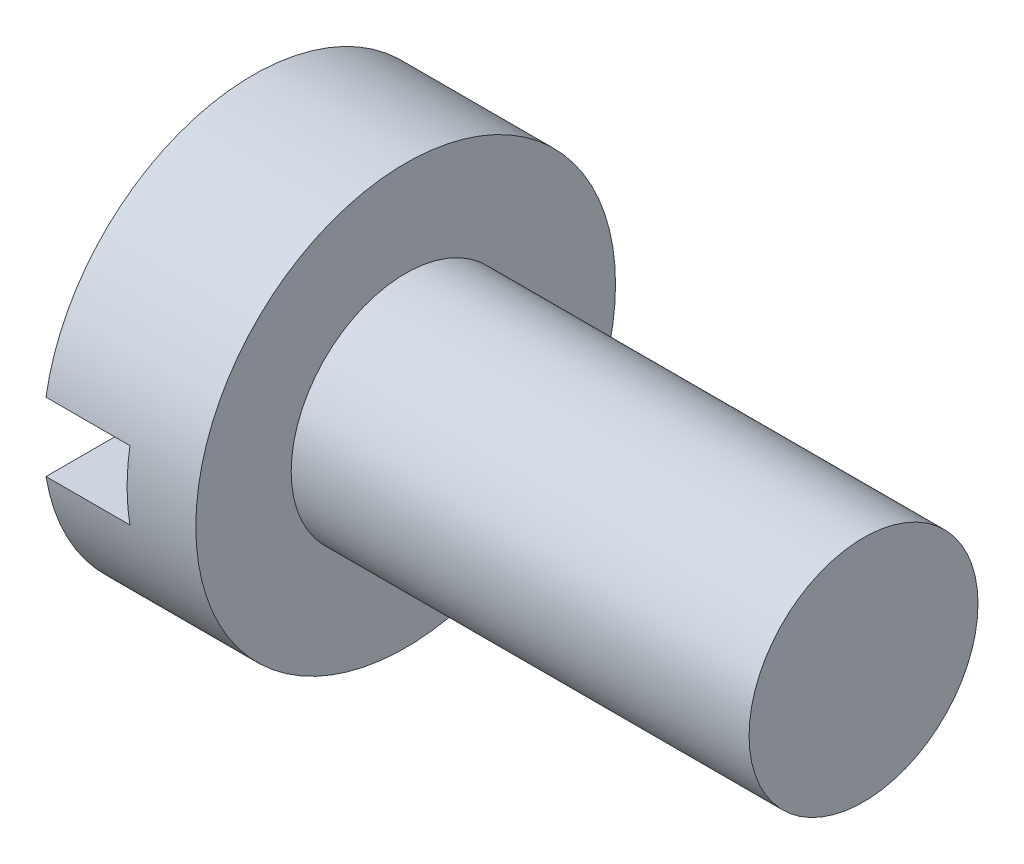
ISO-10303-21;
HEADER;
FILE_DESCRIPTION(('STEP AP214'),'2;1');
FILE_NAME('part.step','',(''),(''),'','','');
FILE_SCHEMA(('AUTOMOTIVE_DESIGN { 1 0 10303 214 1 1 1 1 }'));
ENDSEC;
DATA;
#1=APPLICATION_CONTEXT('core data for automotive mechanical design processes');
#2=APPLICATION_PROTOCOL_DEFINITION('international standard','automotive_design',2000,#1);
#3=PRODUCT_CONTEXT('',#1,'mechanical');
#4=PRODUCT('Part','Part','',(#3));
#5=PRODUCT_RELATED_PRODUCT_CATEGORY('part','',(#4));
#6=PRODUCT_DEFINITION_FORMATION('','',#4);
#7=PRODUCT_DEFINITION_CONTEXT('part definition',#1,'design');
#8=PRODUCT_DEFINITION('design','',#6,#7);
#9=PRODUCT_DEFINITION_SHAPE('','',#8);
#10=(LENGTH_UNIT() NAMED_UNIT(*) SI_UNIT(.MILLI.,.METRE.));
#11=(NAMED_UNIT(*) PLANE_ANGLE_UNIT() SI_UNIT($,.RADIAN.));
#12=(NAMED_UNIT(*) SI_UNIT($,.STERADIAN.) SOLID_ANGLE_UNIT());
#13=UNCERTAINTY_MEASURE_WITH_UNIT(LENGTH_MEASURE(1.E-05),#10,'distance_accuracy_value','');
#14=(GEOMETRIC_REPRESENTATION_CONTEXT(3) GLOBAL_UNCERTAINTY_ASSIGNED_CONTEXT((#13)) GLOBAL_UNIT_ASSIGNED_CONTEXT((#10,
#11,#12)) REPRESENTATION_CONTEXT('',''));
#15=CARTESIAN_POINT('',(0.,0.,0.));
#16=DIRECTION('',(0.,0.,1.));
#17=DIRECTION('',(1.,0.,0.));
#18=AXIS2_PLACEMENT_3D('',#15,#16,#17);
#19=CARTESIAN_POINT('',(0.,0.,0.));
#20=DIRECTION('',(-1.,0.,0.));
#21=DIRECTION('',(0.,0.,1.));
#22=AXIS2_PLACEMENT_3D('',#19,#20,#21);
#23=PLANE('',#22);
#24=DIRECTION('',(0.,0.,-1.));
#25=VECTOR('',#24,1.);
#26=CARTESIAN_POINT('',(0.,0.449999999999999,2.75));
#27=LINE('',#26,#25);
#28=CARTESIAN_POINT('',(0.,0.449999999999999,2.71293199325011));
#29=VERTEX_POINT('',#28);
#30=CARTESIAN_POINT('',(0.,0.449999999999999,-2.71293199325011));
#31=VERTEX_POINT('',#30);
#32=EDGE_CURVE('E95',#29,#31,#27,.T.);
#33=ORIENTED_EDGE('',*,*,#32,.F.);
#34=CARTESIAN_POINT('',(0.,0.,0.));
#35=DIRECTION('',(-1.,0.,0.));
#36=DIRECTION('',(0.,0.,1.));
#37=AXIS2_PLACEMENT_3D('',#34,#35,#36);
#38=CIRCLE('',#37,2.75);
#39=EDGE_CURVE('E99',#29,#31,#38,.T.);
#40=ORIENTED_EDGE('',*,*,#39,.T.);
#41=EDGE_LOOP('',(#33,#40));
#42=FACE_BOUND('',#41,.T.);
#43=ADVANCED_FACE('F39',(#42),#23,.T.);
#44=CARTESIAN_POINT('',(-25.4,0.,0.));
#45=DIRECTION('',(-1.,0.,0.));
#46=DIRECTION('',(0.,0.,1.));
#47=AXIS2_PLACEMENT_3D('',#44,#45,#46);
#48=CYLINDRICAL_SURFACE('',#47,1.5);
#49=CARTESIAN_POINT('',(8.,0.,0.));
#50=DIRECTION('',(-1.,0.,0.));
#51=DIRECTION('',(0.,0.,1.));
#52=AXIS2_PLACEMENT_3D('',#49,#50,#51);
#53=CIRCLE('',#52,1.5);
#54=CARTESIAN_POINT('',(8.,0.,1.5));
#55=VERTEX_POINT('',#54);
#56=EDGE_CURVE('E103',#55,#55,#53,.T.);
#57=ORIENTED_EDGE('',*,*,#56,.T.);
#58=EDGE_LOOP('',(#57));
#59=FACE_BOUND('',#58,.T.);
#60=CARTESIAN_POINT('',(2.,0.,0.));
#61=DIRECTION('',(-1.,0.,0.));
#62=DIRECTION('',(0.,0.,1.));
#63=AXIS2_PLACEMENT_3D('',#60,#61,#62);
#64=CIRCLE('',#63,1.5);
#65=CARTESIAN_POINT('',(2.,0.,1.5));
#66=VERTEX_POINT('',#65);
#67=EDGE_CURVE('E105',#66,#66,#64,.T.);
#68=ORIENTED_EDGE('',*,*,#67,.F.);
#69=EDGE_LOOP('',(#68));
#70=FACE_BOUND('',#69,.T.);
#71=ADVANCED_FACE('F41',(#59,#70),#48,.T.);
#72=CARTESIAN_POINT('',(8.,1.5,0.));
#73=DIRECTION('',(1.,0.,0.));
#74=DIRECTION('',(0.,0.,-1.));
#75=AXIS2_PLACEMENT_3D('',#72,#73,#74);
#76=PLANE('',#75);
#77=ORIENTED_EDGE('',*,*,#56,.F.);
#78=EDGE_LOOP('',(#77));
#79=FACE_BOUND('',#78,.T.);
#80=ADVANCED_FACE('F128',(#79),#76,.T.);
#81=DIRECTION('',(0.,0.,1.));
#82=VECTOR('',#81,1.);
#83=CARTESIAN_POINT('',(0.,-0.45,-2.75));
#84=LINE('',#83,#82);
#85=CARTESIAN_POINT('',(0.,-0.45,-2.71293199325011));
#86=VERTEX_POINT('',#85);
#87=CARTESIAN_POINT('',(0.,-0.45,2.71293199325011));
#88=VERTEX_POINT('',#87);
#89=EDGE_CURVE('E83',#86,#88,#84,.T.);
#90=ORIENTED_EDGE('',*,*,#89,.F.);
#91=EDGE_CURVE('E94',#86,#88,#38,.T.);
#92=ORIENTED_EDGE('',*,*,#91,.T.);
#93=EDGE_LOOP('',(#90,#92));
#94=FACE_BOUND('',#93,.T.);
#95=ADVANCED_FACE('F93',(#94),#23,.T.);
#96=CARTESIAN_POINT('',(-25.4,0.,0.));
#97=DIRECTION('',(-1.,0.,0.));
#98=DIRECTION('',(0.,0.,1.));
#99=AXIS2_PLACEMENT_3D('',#96,#97,#98);
#100=CYLINDRICAL_SURFACE('',#99,2.75);
#101=DIRECTION('',(-1.,0.,0.));
#102=VECTOR('',#101,1.);
#103=CARTESIAN_POINT('',(-25.4,0.449999999999999,2.71293199325011));
#104=LINE('',#103,#102);
#105=CARTESIAN_POINT('',(1.1,0.449999999999999,2.71293199325011));
#106=VERTEX_POINT('',#105);
#107=EDGE_CURVE('E11',#106,#29,#104,.T.);
#108=ORIENTED_EDGE('',*,*,#107,.F.);
#109=CARTESIAN_POINT('',(1.1,0.,0.));
#110=DIRECTION('',(1.,0.,0.));
#111=DIRECTION('',(0.,0.,-1.));
#112=AXIS2_PLACEMENT_3D('',#109,#110,#111);
#113=CIRCLE('',#112,2.75);
#114=CARTESIAN_POINT('',(1.1,-0.45,2.71293199325011));
#115=VERTEX_POINT('',#114);
#116=EDGE_CURVE('E61',#115,#106,#113,.F.);
#117=ORIENTED_EDGE('',*,*,#116,.F.);
#118=DIRECTION('',(-1.,0.,0.));
#119=VECTOR('',#118,1.);
#120=CARTESIAN_POINT('',(-25.4,-0.45,2.71293199325011));
#121=LINE('',#120,#119);
#122=EDGE_CURVE('E47',#88,#115,#121,.F.);
#123=ORIENTED_EDGE('',*,*,#122,.F.);
#124=ORIENTED_EDGE('',*,*,#91,.F.);
#125=DIRECTION('',(-1.,0.,0.));
#126=VECTOR('',#125,1.);
#127=CARTESIAN_POINT('',(-25.4,-0.45,-2.71293199325011));
#128=LINE('',#127,#126);
#129=CARTESIAN_POINT('',(1.1,-0.45,-2.71293199325011));
#130=VERTEX_POINT('',#129);
#131=EDGE_CURVE('E80',#130,#86,#128,.T.);
#132=ORIENTED_EDGE('',*,*,#131,.F.);
#133=CARTESIAN_POINT('',(1.1,0.449999999999999,-2.71293199325011));
#134=VERTEX_POINT('',#133);
#135=EDGE_CURVE('E89',#134,#130,#113,.F.);
#136=ORIENTED_EDGE('',*,*,#135,.F.);
#137=DIRECTION('',(-1.,0.,0.));
#138=VECTOR('',#137,1.);
#139=CARTESIAN_POINT('',(-25.4,0.449999999999999,-2.71293199325011));
#140=LINE('',#139,#138);
#141=EDGE_CURVE('E88',#31,#134,#140,.F.);
#142=ORIENTED_EDGE('',*,*,#141,.F.);
#143=ORIENTED_EDGE('',*,*,#39,.F.);
#144=EDGE_LOOP('',(#108,#117,#123,#124,#132,#136,#142,#143));
#145=FACE_BOUND('',#144,.T.);
#146=CARTESIAN_POINT('',(2.,0.,0.));
#147=DIRECTION('',(-1.,0.,0.));
#148=DIRECTION('',(0.,0.,1.));
#149=AXIS2_PLACEMENT_3D('',#146,#147,#148);
#150=CIRCLE('',#149,2.75);
#151=CARTESIAN_POINT('',(2.,0.,2.75));
#152=VERTEX_POINT('',#151);
#153=EDGE_CURVE('E100',#152,#152,#150,.T.);
#154=ORIENTED_EDGE('',*,*,#153,.T.);
#155=EDGE_LOOP('',(#154));
#156=FACE_BOUND('',#155,.T.);
#157=ADVANCED_FACE('F97',(#145,#156),#100,.T.);
#158=CARTESIAN_POINT('',(2.,1.5,0.));
#159=DIRECTION('',(-1.,0.,0.));
#160=DIRECTION('',(0.,0.,1.));
#161=AXIS2_PLACEMENT_3D('',#158,#159,#160);
#162=PLANE('',#161);
#163=ORIENTED_EDGE('',*,*,#153,.F.);
#164=EDGE_LOOP('',(#163));
#165=FACE_BOUND('',#164,.T.);
#166=ORIENTED_EDGE('',*,*,#67,.T.);
#167=EDGE_LOOP('',(#166));
#168=FACE_BOUND('',#167,.T.);
#169=ADVANCED_FACE('F125',(#165,#168),#162,.F.);
#170=CARTESIAN_POINT('',(1.1,0.449999999999999,2.75));
#171=DIRECTION('',(0.,1.,0.));
#172=DIRECTION('',(0.,0.,1.));
#173=AXIS2_PLACEMENT_3D('',#170,#171,#172);
#174=PLANE('',#173);
#175=ORIENTED_EDGE('',*,*,#141,.T.);
#176=DIRECTION('',(0.,0.,-1.));
#177=VECTOR('',#176,1.);
#178=CARTESIAN_POINT('',(1.1,0.449999999999999,2.75));
#179=LINE('',#178,#177);
#180=EDGE_CURVE('E54',#106,#134,#179,.T.);
#181=ORIENTED_EDGE('',*,*,#180,.F.);
#182=ORIENTED_EDGE('',*,*,#107,.T.);
#183=ORIENTED_EDGE('',*,*,#32,.T.);
#184=EDGE_LOOP('',(#175,#181,#182,#183));
#185=FACE_BOUND('',#184,.T.);
#186=ADVANCED_FACE('F114',(#185),#174,.F.);
#187=CARTESIAN_POINT('',(1.1,-0.45,-2.75));
#188=DIRECTION('',(0.,-1.,0.));
#189=DIRECTION('',(0.,0.,-1.));
#190=AXIS2_PLACEMENT_3D('',#187,#188,#189);
#191=PLANE('',#190);
#192=ORIENTED_EDGE('',*,*,#122,.T.);
#193=DIRECTION('',(0.,0.,1.));
#194=VECTOR('',#193,1.);
#195=CARTESIAN_POINT('',(1.1,-0.45,-2.75));
#196=LINE('',#195,#194);
#197=EDGE_CURVE('E85',#130,#115,#196,.T.);
#198=ORIENTED_EDGE('',*,*,#197,.F.);
#199=ORIENTED_EDGE('',*,*,#131,.T.);
#200=ORIENTED_EDGE('',*,*,#89,.T.);
#201=EDGE_LOOP('',(#192,#198,#199,#200));
#202=FACE_BOUND('',#201,.T.);
#203=ADVANCED_FACE('F82',(#202),#191,.F.);
#204=CARTESIAN_POINT('',(1.1,-0.45,-2.75));
#205=DIRECTION('',(1.,0.,0.));
#206=DIRECTION('',(0.,0.,-1.));
#207=AXIS2_PLACEMENT_3D('',#204,#205,#206);
#208=PLANE('',#207);
#209=ORIENTED_EDGE('',*,*,#197,.T.);
#210=ORIENTED_EDGE('',*,*,#116,.T.);
#211=ORIENTED_EDGE('',*,*,#180,.T.);
#212=ORIENTED_EDGE('',*,*,#135,.T.);
#213=EDGE_LOOP('',(#209,#210,#211,#212));
#214=FACE_BOUND('',#213,.T.);
#215=ADVANCED_FACE('F112',(#214),#208,.F.);
#216=CLOSED_SHELL('',(#43,#71,#80,#95,#157,#169,#186,#203,#215));
#217=MANIFOLD_SOLID_BREP('B2',#216);
#218=ADVANCED_BREP_SHAPE_REPRESENTATION('',(#18,#217),#14);
#219=SHAPE_DEFINITION_REPRESENTATION(#9,#218);
ENDSEC;
END-ISO-10303-21;
